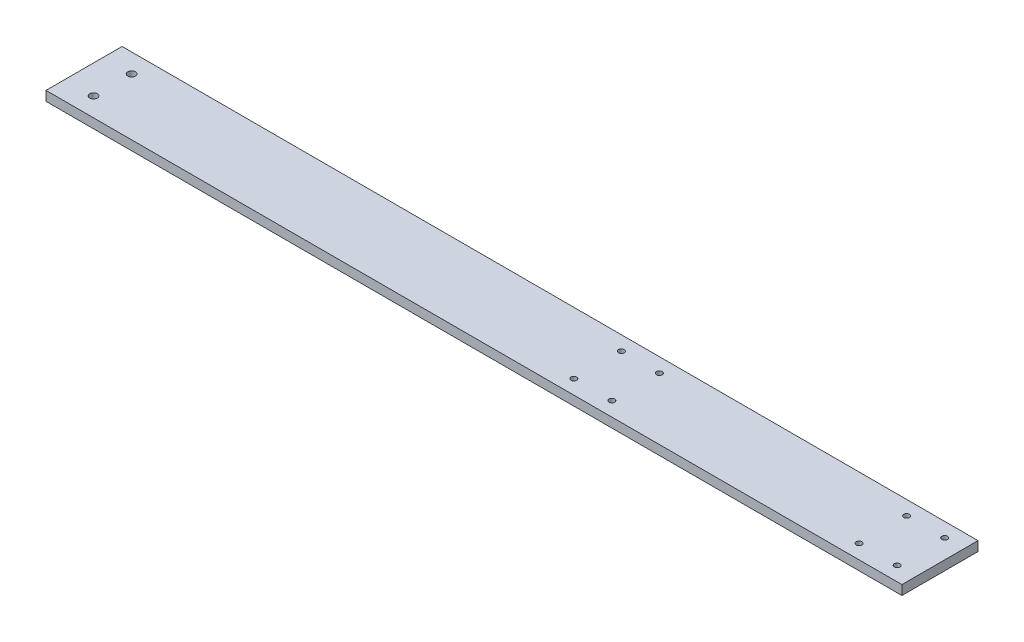
ISO-10303-21;
HEADER;
FILE_DESCRIPTION(('STEP AP214'),'2;1');
FILE_NAME('part.step','',(''),(''),'','','');
FILE_SCHEMA(('AUTOMOTIVE_DESIGN { 1 0 10303 214 1 1 1 1 }'));
ENDSEC;
DATA;
#1=APPLICATION_CONTEXT('core data for automotive mechanical design processes');
#2=APPLICATION_PROTOCOL_DEFINITION('international standard','automotive_design',2000,#1);
#3=PRODUCT_CONTEXT('',#1,'mechanical');
#4=PRODUCT('Part','Part','',(#3));
#5=PRODUCT_RELATED_PRODUCT_CATEGORY('part','',(#4));
#6=PRODUCT_DEFINITION_FORMATION('','',#4);
#7=PRODUCT_DEFINITION_CONTEXT('part definition',#1,'design');
#8=PRODUCT_DEFINITION('design','',#6,#7);
#9=PRODUCT_DEFINITION_SHAPE('','',#8);
#10=(LENGTH_UNIT() NAMED_UNIT(*) SI_UNIT(.MILLI.,.METRE.));
#11=(NAMED_UNIT(*) PLANE_ANGLE_UNIT() SI_UNIT($,.RADIAN.));
#12=(NAMED_UNIT(*) SI_UNIT($,.STERADIAN.) SOLID_ANGLE_UNIT());
#13=UNCERTAINTY_MEASURE_WITH_UNIT(LENGTH_MEASURE(1.E-05),#10,'distance_accuracy_value','');
#14=(GEOMETRIC_REPRESENTATION_CONTEXT(3) GLOBAL_UNCERTAINTY_ASSIGNED_CONTEXT((#13)) GLOBAL_UNIT_ASSIGNED_CONTEXT((#10,
#11,#12)) REPRESENTATION_CONTEXT('',''));
#15=CARTESIAN_POINT('',(0.,0.,0.));
#16=DIRECTION('',(0.,0.,1.));
#17=DIRECTION('',(1.,0.,0.));
#18=AXIS2_PLACEMENT_3D('',#15,#16,#17);
#19=CARTESIAN_POINT('',(0.,5.,0.));
#20=DIRECTION('',(0.,1.,0.));
#21=DIRECTION('',(0.,0.,1.));
#22=AXIS2_PLACEMENT_3D('',#19,#20,#21);
#23=PLANE('',#22);
#24=CARTESIAN_POINT('',(-210.,5.,10.));
#25=DIRECTION('',(0.,1.,0.));
#26=DIRECTION('',(0.,0.,1.));
#27=AXIS2_PLACEMENT_3D('',#24,#25,#26);
#28=CIRCLE('',#27,2.);
#29=CARTESIAN_POINT('',(-210.,5.,12.));
#30=VERTEX_POINT('',#29);
#31=EDGE_CURVE('E192',#30,#30,#28,.T.);
#32=ORIENTED_EDGE('',*,*,#31,.F.);
#33=EDGE_LOOP('',(#32));
#34=FACE_BOUND('',#33,.T.);
#35=CARTESIAN_POINT('',(45.,5.,12.5));
#36=DIRECTION('',(0.,1.,0.));
#37=DIRECTION('',(0.,0.,-1.));
#38=AXIS2_PLACEMENT_3D('',#35,#36,#37);
#39=CIRCLE('',#38,1.5);
#40=CARTESIAN_POINT('',(45.,5.,11.));
#41=VERTEX_POINT('',#40);
#42=EDGE_CURVE('E199',#41,#41,#39,.T.);
#43=ORIENTED_EDGE('',*,*,#42,.F.);
#44=EDGE_LOOP('',(#43));
#45=FACE_BOUND('',#44,.T.);
#46=CARTESIAN_POINT('',(65.,5.,-12.5));
#47=DIRECTION('',(0.,1.,0.));
#48=DIRECTION('',(0.,0.,1.));
#49=AXIS2_PLACEMENT_3D('',#46,#47,#48);
#50=CIRCLE('',#49,1.5);
#51=CARTESIAN_POINT('',(65.,5.,-11.));
#52=VERTEX_POINT('',#51);
#53=EDGE_CURVE('E205',#52,#52,#50,.T.);
#54=ORIENTED_EDGE('',*,*,#53,.F.);
#55=EDGE_LOOP('',(#54));
#56=FACE_BOUND('',#55,.T.);
#57=CARTESIAN_POINT('',(195.,5.,12.5));
#58=DIRECTION('',(0.,1.,0.));
#59=DIRECTION('',(0.,0.,-1.));
#60=AXIS2_PLACEMENT_3D('',#57,#58,#59);
#61=CIRCLE('',#60,1.5);
#62=CARTESIAN_POINT('',(195.,5.,11.));
#63=VERTEX_POINT('',#62);
#64=EDGE_CURVE('E211',#63,#63,#61,.T.);
#65=ORIENTED_EDGE('',*,*,#64,.F.);
#66=EDGE_LOOP('',(#65));
#67=FACE_BOUND('',#66,.T.);
#68=CARTESIAN_POINT('',(215.,5.,-12.5));
#69=DIRECTION('',(0.,1.,0.));
#70=DIRECTION('',(0.,0.,1.));
#71=AXIS2_PLACEMENT_3D('',#68,#69,#70);
#72=CIRCLE('',#71,1.5);
#73=CARTESIAN_POINT('',(215.,5.,-11.));
#74=VERTEX_POINT('',#73);
#75=EDGE_CURVE('E109',#74,#74,#72,.T.);
#76=ORIENTED_EDGE('',*,*,#75,.F.);
#77=EDGE_LOOP('',(#76));
#78=FACE_BOUND('',#77,.T.);
#79=DIRECTION('',(0.,0.,1.));
#80=VECTOR('',#79,1.);
#81=CARTESIAN_POINT('',(-225.,5.,-20.));
#82=LINE('',#81,#80);
#83=CARTESIAN_POINT('',(-225.,5.,-20.));
#84=VERTEX_POINT('',#83);
#85=CARTESIAN_POINT('',(-225.,5.,20.));
#86=VERTEX_POINT('',#85);
#87=EDGE_CURVE('E91',#84,#86,#82,.T.);
#88=ORIENTED_EDGE('',*,*,#87,.T.);
#89=DIRECTION('',(1.,0.,0.));
#90=VECTOR('',#89,1.);
#91=CARTESIAN_POINT('',(-225.,5.,20.));
#92=LINE('',#91,#90);
#93=CARTESIAN_POINT('',(225.,5.,20.));
#94=VERTEX_POINT('',#93);
#95=EDGE_CURVE('E86',#86,#94,#92,.T.);
#96=ORIENTED_EDGE('',*,*,#95,.T.);
#97=DIRECTION('',(0.,0.,-1.));
#98=VECTOR('',#97,1.);
#99=CARTESIAN_POINT('',(225.,5.,-20.));
#100=LINE('',#99,#98);
#101=CARTESIAN_POINT('',(225.,5.,-20.));
#102=VERTEX_POINT('',#101);
#103=EDGE_CURVE('E89',#94,#102,#100,.T.);
#104=ORIENTED_EDGE('',*,*,#103,.T.);
#105=DIRECTION('',(-1.,0.,0.));
#106=VECTOR('',#105,1.);
#107=CARTESIAN_POINT('',(-225.,5.,-20.));
#108=LINE('',#107,#106);
#109=EDGE_CURVE('E55',#102,#84,#108,.T.);
#110=ORIENTED_EDGE('',*,*,#109,.T.);
#111=EDGE_LOOP('',(#88,#96,#104,#110));
#112=FACE_BOUND('',#111,.T.);
#113=CARTESIAN_POINT('',(195.,5.,-12.5));
#114=DIRECTION('',(0.,1.,0.));
#115=DIRECTION('',(0.,0.,1.));
#116=AXIS2_PLACEMENT_3D('',#113,#114,#115);
#117=CIRCLE('',#116,1.5);
#118=CARTESIAN_POINT('',(195.,5.,-11.));
#119=VERTEX_POINT('',#118);
#120=EDGE_CURVE('E214',#119,#119,#117,.T.);
#121=ORIENTED_EDGE('',*,*,#120,.F.);
#122=EDGE_LOOP('',(#121));
#123=FACE_BOUND('',#122,.T.);
#124=CARTESIAN_POINT('',(215.,5.,12.5));
#125=DIRECTION('',(0.,1.,0.));
#126=DIRECTION('',(0.,0.,-1.));
#127=AXIS2_PLACEMENT_3D('',#124,#125,#126);
#128=CIRCLE('',#127,1.5);
#129=CARTESIAN_POINT('',(215.,5.,11.));
#130=VERTEX_POINT('',#129);
#131=EDGE_CURVE('E208',#130,#130,#128,.T.);
#132=ORIENTED_EDGE('',*,*,#131,.F.);
#133=EDGE_LOOP('',(#132));
#134=FACE_BOUND('',#133,.T.);
#135=CARTESIAN_POINT('',(45.,5.,-12.5));
#136=DIRECTION('',(0.,1.,0.));
#137=DIRECTION('',(0.,0.,1.));
#138=AXIS2_PLACEMENT_3D('',#135,#136,#137);
#139=CIRCLE('',#138,1.5);
#140=CARTESIAN_POINT('',(45.,5.,-11.));
#141=VERTEX_POINT('',#140);
#142=EDGE_CURVE('E202',#141,#141,#139,.T.);
#143=ORIENTED_EDGE('',*,*,#142,.F.);
#144=EDGE_LOOP('',(#143));
#145=FACE_BOUND('',#144,.T.);
#146=CARTESIAN_POINT('',(65.,5.,12.5));
#147=DIRECTION('',(0.,1.,0.));
#148=DIRECTION('',(0.,0.,-1.));
#149=AXIS2_PLACEMENT_3D('',#146,#147,#148);
#150=CIRCLE('',#149,1.5);
#151=CARTESIAN_POINT('',(65.,5.,11.));
#152=VERTEX_POINT('',#151);
#153=EDGE_CURVE('E195',#152,#152,#150,.T.);
#154=ORIENTED_EDGE('',*,*,#153,.F.);
#155=EDGE_LOOP('',(#154));
#156=FACE_BOUND('',#155,.T.);
#157=CARTESIAN_POINT('',(-210.,5.,-10.));
#158=DIRECTION('',(0.,1.,0.));
#159=DIRECTION('',(0.,0.,1.));
#160=AXIS2_PLACEMENT_3D('',#157,#158,#159);
#161=CIRCLE('',#160,2.);
#162=CARTESIAN_POINT('',(-210.,5.,-8.));
#163=VERTEX_POINT('',#162);
#164=EDGE_CURVE('E187',#163,#163,#161,.T.);
#165=ORIENTED_EDGE('',*,*,#164,.F.);
#166=EDGE_LOOP('',(#165));
#167=FACE_BOUND('',#166,.T.);
#168=ADVANCED_FACE('F37',(#34,#45,#56,#67,#78,#112,#123,#134,#145,#156,#167),#23,.T.);
#169=CARTESIAN_POINT('',(0.,0.,0.));
#170=DIRECTION('',(0.,1.,0.));
#171=DIRECTION('',(0.,0.,1.));
#172=AXIS2_PLACEMENT_3D('',#169,#170,#171);
#173=PLANE('',#172);
#174=CARTESIAN_POINT('',(45.,0.,-12.5));
#175=DIRECTION('',(0.,1.,0.));
#176=DIRECTION('',(0.,0.,1.));
#177=AXIS2_PLACEMENT_3D('',#174,#175,#176);
#178=CIRCLE('',#177,3.50000000000006);
#179=CARTESIAN_POINT('',(45.,0.,-8.99999999999994));
#180=VERTEX_POINT('',#179);
#181=EDGE_CURVE('E137',#180,#180,#178,.T.);
#182=ORIENTED_EDGE('',*,*,#181,.T.);
#183=EDGE_LOOP('',(#182));
#184=FACE_BOUND('',#183,.T.);
#185=CARTESIAN_POINT('',(45.,0.,12.5));
#186=DIRECTION('',(0.,1.,0.));
#187=DIRECTION('',(0.,0.,1.));
#188=AXIS2_PLACEMENT_3D('',#185,#186,#187);
#189=CIRCLE('',#188,3.50000000000006);
#190=CARTESIAN_POINT('',(45.,0.,16.0000000000001));
#191=VERTEX_POINT('',#190);
#192=EDGE_CURVE('E134',#191,#191,#189,.T.);
#193=ORIENTED_EDGE('',*,*,#192,.T.);
#194=EDGE_LOOP('',(#193));
#195=FACE_BOUND('',#194,.T.);
#196=CARTESIAN_POINT('',(65.,0.,12.5));
#197=DIRECTION('',(0.,1.,0.));
#198=DIRECTION('',(0.,0.,1.));
#199=AXIS2_PLACEMENT_3D('',#196,#197,#198);
#200=CIRCLE('',#199,3.5);
#201=CARTESIAN_POINT('',(65.,0.,16.));
#202=VERTEX_POINT('',#201);
#203=EDGE_CURVE('E131',#202,#202,#200,.T.);
#204=ORIENTED_EDGE('',*,*,#203,.T.);
#205=EDGE_LOOP('',(#204));
#206=FACE_BOUND('',#205,.T.);
#207=CARTESIAN_POINT('',(65.,0.,-12.5));
#208=DIRECTION('',(0.,1.,0.));
#209=DIRECTION('',(0.,0.,1.));
#210=AXIS2_PLACEMENT_3D('',#207,#208,#209);
#211=CIRCLE('',#210,3.5);
#212=CARTESIAN_POINT('',(65.,0.,-9.));
#213=VERTEX_POINT('',#212);
#214=EDGE_CURVE('E128',#213,#213,#211,.T.);
#215=ORIENTED_EDGE('',*,*,#214,.T.);
#216=EDGE_LOOP('',(#215));
#217=FACE_BOUND('',#216,.T.);
#218=CARTESIAN_POINT('',(215.,0.,-12.5));
#219=DIRECTION('',(0.,1.,0.));
#220=DIRECTION('',(0.,0.,1.));
#221=AXIS2_PLACEMENT_3D('',#218,#219,#220);
#222=CIRCLE('',#221,3.5);
#223=CARTESIAN_POINT('',(215.,0.,-9.));
#224=VERTEX_POINT('',#223);
#225=EDGE_CURVE('E125',#224,#224,#222,.T.);
#226=ORIENTED_EDGE('',*,*,#225,.T.);
#227=EDGE_LOOP('',(#226));
#228=FACE_BOUND('',#227,.T.);
#229=CARTESIAN_POINT('',(195.,0.,-12.5));
#230=DIRECTION('',(0.,1.,0.));
#231=DIRECTION('',(0.,0.,1.));
#232=AXIS2_PLACEMENT_3D('',#229,#230,#231);
#233=CIRCLE('',#232,3.5);
#234=CARTESIAN_POINT('',(195.,0.,-9.));
#235=VERTEX_POINT('',#234);
#236=EDGE_CURVE('E122',#235,#235,#233,.T.);
#237=ORIENTED_EDGE('',*,*,#236,.T.);
#238=EDGE_LOOP('',(#237));
#239=FACE_BOUND('',#238,.T.);
#240=CARTESIAN_POINT('',(195.,0.,12.5));
#241=DIRECTION('',(0.,1.,0.));
#242=DIRECTION('',(0.,0.,1.));
#243=AXIS2_PLACEMENT_3D('',#240,#241,#242);
#244=CIRCLE('',#243,3.5);
#245=CARTESIAN_POINT('',(195.,0.,16.));
#246=VERTEX_POINT('',#245);
#247=EDGE_CURVE('E119',#246,#246,#244,.T.);
#248=ORIENTED_EDGE('',*,*,#247,.T.);
#249=EDGE_LOOP('',(#248));
#250=FACE_BOUND('',#249,.T.);
#251=CARTESIAN_POINT('',(215.,0.,12.5));
#252=DIRECTION('',(0.,1.,0.));
#253=DIRECTION('',(0.,0.,1.));
#254=AXIS2_PLACEMENT_3D('',#251,#252,#253);
#255=CIRCLE('',#254,3.5);
#256=CARTESIAN_POINT('',(215.,0.,16.));
#257=VERTEX_POINT('',#256);
#258=EDGE_CURVE('E116',#257,#257,#255,.T.);
#259=ORIENTED_EDGE('',*,*,#258,.T.);
#260=EDGE_LOOP('',(#259));
#261=FACE_BOUND('',#260,.T.);
#262=DIRECTION('',(0.,0.,1.));
#263=VECTOR('',#262,1.);
#264=CARTESIAN_POINT('',(-225.,0.,-20.));
#265=LINE('',#264,#263);
#266=CARTESIAN_POINT('',(-225.,0.,-20.));
#267=VERTEX_POINT('',#266);
#268=CARTESIAN_POINT('',(-225.,0.,20.));
#269=VERTEX_POINT('',#268);
#270=EDGE_CURVE('E106',#267,#269,#265,.T.);
#271=ORIENTED_EDGE('',*,*,#270,.F.);
#272=DIRECTION('',(-1.,0.,0.));
#273=VECTOR('',#272,1.);
#274=CARTESIAN_POINT('',(-225.,0.,-20.));
#275=LINE('',#274,#273);
#276=CARTESIAN_POINT('',(225.,0.,-20.));
#277=VERTEX_POINT('',#276);
#278=EDGE_CURVE('E78',#277,#267,#275,.T.);
#279=ORIENTED_EDGE('',*,*,#278,.F.);
#280=DIRECTION('',(0.,0.,-1.));
#281=VECTOR('',#280,1.);
#282=CARTESIAN_POINT('',(225.,0.,-20.));
#283=LINE('',#282,#281);
#284=CARTESIAN_POINT('',(225.,0.,20.));
#285=VERTEX_POINT('',#284);
#286=EDGE_CURVE('E72',#285,#277,#283,.T.);
#287=ORIENTED_EDGE('',*,*,#286,.F.);
#288=DIRECTION('',(1.,0.,0.));
#289=VECTOR('',#288,1.);
#290=CARTESIAN_POINT('',(-225.,0.,20.));
#291=LINE('',#290,#289);
#292=EDGE_CURVE('E96',#269,#285,#291,.T.);
#293=ORIENTED_EDGE('',*,*,#292,.F.);
#294=EDGE_LOOP('',(#271,#279,#287,#293));
#295=FACE_BOUND('',#294,.T.);
#296=CARTESIAN_POINT('',(-210.,0.,10.));
#297=DIRECTION('',(0.,1.,0.));
#298=DIRECTION('',(0.,0.,1.));
#299=AXIS2_PLACEMENT_3D('',#296,#297,#298);
#300=CIRCLE('',#299,2.);
#301=CARTESIAN_POINT('',(-210.,0.,12.));
#302=VERTEX_POINT('',#301);
#303=EDGE_CURVE('E182',#302,#302,#300,.T.);
#304=ORIENTED_EDGE('',*,*,#303,.T.);
#305=EDGE_LOOP('',(#304));
#306=FACE_BOUND('',#305,.T.);
#307=CARTESIAN_POINT('',(-210.,0.,-10.));
#308=DIRECTION('',(0.,1.,0.));
#309=DIRECTION('',(0.,0.,1.));
#310=AXIS2_PLACEMENT_3D('',#307,#308,#309);
#311=CIRCLE('',#310,2.);
#312=CARTESIAN_POINT('',(-210.,0.,-8.));
#313=VERTEX_POINT('',#312);
#314=EDGE_CURVE('E185',#313,#313,#311,.T.);
#315=ORIENTED_EDGE('',*,*,#314,.T.);
#316=EDGE_LOOP('',(#315));
#317=FACE_BOUND('',#316,.T.);
#318=ADVANCED_FACE('F169',(#184,#195,#206,#217,#228,#239,#250,#261,#295,#306,#317),#173,.F.);
#319=CARTESIAN_POINT('',(-225.,5.,-20.));
#320=DIRECTION('',(1.,0.,0.));
#321=DIRECTION('',(0.,0.,-1.));
#322=AXIS2_PLACEMENT_3D('',#319,#320,#321);
#323=PLANE('',#322);
#324=ORIENTED_EDGE('',*,*,#270,.T.);
#325=DIRECTION('',(0.,-1.,0.));
#326=VECTOR('',#325,1.);
#327=CARTESIAN_POINT('',(-225.,5.,20.));
#328=LINE('',#327,#326);
#329=EDGE_CURVE('E97',#86,#269,#328,.T.);
#330=ORIENTED_EDGE('',*,*,#329,.F.);
#331=ORIENTED_EDGE('',*,*,#87,.F.);
#332=DIRECTION('',(0.,-1.,0.));
#333=VECTOR('',#332,1.);
#334=CARTESIAN_POINT('',(-225.,5.,-20.));
#335=LINE('',#334,#333);
#336=EDGE_CURVE('E102',#84,#267,#335,.T.);
#337=ORIENTED_EDGE('',*,*,#336,.T.);
#338=EDGE_LOOP('',(#324,#330,#331,#337));
#339=FACE_BOUND('',#338,.T.);
#340=ADVANCED_FACE('F172',(#339),#323,.F.);
#341=CARTESIAN_POINT('',(-225.,5.,20.));
#342=DIRECTION('',(0.,0.,-1.));
#343=DIRECTION('',(-1.,0.,0.));
#344=AXIS2_PLACEMENT_3D('',#341,#342,#343);
#345=PLANE('',#344);
#346=ORIENTED_EDGE('',*,*,#292,.T.);
#347=DIRECTION('',(0.,-1.,0.));
#348=VECTOR('',#347,1.);
#349=CARTESIAN_POINT('',(225.,5.,20.));
#350=LINE('',#349,#348);
#351=EDGE_CURVE('E94',#94,#285,#350,.T.);
#352=ORIENTED_EDGE('',*,*,#351,.F.);
#353=ORIENTED_EDGE('',*,*,#95,.F.);
#354=ORIENTED_EDGE('',*,*,#329,.T.);
#355=EDGE_LOOP('',(#346,#352,#353,#354));
#356=FACE_BOUND('',#355,.T.);
#357=ADVANCED_FACE('F95',(#356),#345,.F.);
#358=CARTESIAN_POINT('',(225.,5.,-20.));
#359=DIRECTION('',(-1.,0.,0.));
#360=DIRECTION('',(0.,0.,1.));
#361=AXIS2_PLACEMENT_3D('',#358,#359,#360);
#362=PLANE('',#361);
#363=ORIENTED_EDGE('',*,*,#286,.T.);
#364=DIRECTION('',(0.,-1.,0.));
#365=VECTOR('',#364,1.);
#366=CARTESIAN_POINT('',(225.,5.,-20.));
#367=LINE('',#366,#365);
#368=EDGE_CURVE('E98',#102,#277,#367,.T.);
#369=ORIENTED_EDGE('',*,*,#368,.F.);
#370=ORIENTED_EDGE('',*,*,#103,.F.);
#371=ORIENTED_EDGE('',*,*,#351,.T.);
#372=EDGE_LOOP('',(#363,#369,#370,#371));
#373=FACE_BOUND('',#372,.T.);
#374=ADVANCED_FACE('F100',(#373),#362,.F.);
#375=CARTESIAN_POINT('',(-225.,5.,-20.));
#376=DIRECTION('',(0.,0.,1.));
#377=DIRECTION('',(1.,0.,0.));
#378=AXIS2_PLACEMENT_3D('',#375,#376,#377);
#379=PLANE('',#378);
#380=ORIENTED_EDGE('',*,*,#278,.T.);
#381=ORIENTED_EDGE('',*,*,#336,.F.);
#382=ORIENTED_EDGE('',*,*,#109,.F.);
#383=ORIENTED_EDGE('',*,*,#368,.T.);
#384=EDGE_LOOP('',(#380,#381,#382,#383));
#385=FACE_BOUND('',#384,.T.);
#386=ADVANCED_FACE('F232',(#385),#379,.F.);
#387=CARTESIAN_POINT('',(215.,5.,-12.5));
#388=DIRECTION('',(0.,-1.,0.));
#389=DIRECTION('',(0.,0.,-1.));
#390=AXIS2_PLACEMENT_3D('',#387,#388,#389);
#391=CYLINDRICAL_SURFACE('',#390,1.5);
#392=CARTESIAN_POINT('',(215.,2.,-12.5));
#393=DIRECTION('',(0.,1.,0.));
#394=DIRECTION('',(0.,0.,1.));
#395=AXIS2_PLACEMENT_3D('',#392,#393,#394);
#396=CIRCLE('',#395,1.5);
#397=CARTESIAN_POINT('',(215.,2.,-11.));
#398=VERTEX_POINT('',#397);
#399=EDGE_CURVE('E152',#398,#398,#396,.F.);
#400=ORIENTED_EDGE('',*,*,#399,.T.);
#401=EDGE_LOOP('',(#400));
#402=FACE_BOUND('',#401,.T.);
#403=ORIENTED_EDGE('',*,*,#75,.T.);
#404=EDGE_LOOP('',(#403));
#405=FACE_BOUND('',#404,.T.);
#406=ADVANCED_FACE('F220',(#402,#405),#391,.F.);
#407=CARTESIAN_POINT('',(195.,5.,-12.5));
#408=DIRECTION('',(0.,-1.,0.));
#409=DIRECTION('',(0.,0.,-1.));
#410=AXIS2_PLACEMENT_3D('',#407,#408,#409);
#411=CYLINDRICAL_SURFACE('',#410,1.5);
#412=CARTESIAN_POINT('',(195.,2.,-12.5));
#413=DIRECTION('',(0.,1.,0.));
#414=DIRECTION('',(0.,0.,1.));
#415=AXIS2_PLACEMENT_3D('',#412,#413,#414);
#416=CIRCLE('',#415,1.5);
#417=CARTESIAN_POINT('',(195.,2.,-11.));
#418=VERTEX_POINT('',#417);
#419=EDGE_CURVE('E155',#418,#418,#416,.F.);
#420=ORIENTED_EDGE('',*,*,#419,.T.);
#421=EDGE_LOOP('',(#420));
#422=FACE_BOUND('',#421,.T.);
#423=ORIENTED_EDGE('',*,*,#120,.T.);
#424=EDGE_LOOP('',(#423));
#425=FACE_BOUND('',#424,.T.);
#426=ADVANCED_FACE('F295',(#422,#425),#411,.F.);
#427=CARTESIAN_POINT('',(195.,5.,12.5));
#428=DIRECTION('',(0.,-1.,0.));
#429=DIRECTION('',(0.,0.,-1.));
#430=AXIS2_PLACEMENT_3D('',#427,#428,#429);
#431=CYLINDRICAL_SURFACE('',#430,1.5);
#432=CARTESIAN_POINT('',(195.,2.,12.5));
#433=DIRECTION('',(0.,1.,0.));
#434=DIRECTION('',(0.,0.,1.));
#435=AXIS2_PLACEMENT_3D('',#432,#433,#434);
#436=CIRCLE('',#435,1.5);
#437=CARTESIAN_POINT('',(195.,2.,14.));
#438=VERTEX_POINT('',#437);
#439=EDGE_CURVE('E47',#438,#438,#436,.F.);
#440=ORIENTED_EDGE('',*,*,#439,.T.);
#441=EDGE_LOOP('',(#440));
#442=FACE_BOUND('',#441,.T.);
#443=ORIENTED_EDGE('',*,*,#64,.T.);
#444=EDGE_LOOP('',(#443));
#445=FACE_BOUND('',#444,.T.);
#446=ADVANCED_FACE('F160',(#442,#445),#431,.F.);
#447=CARTESIAN_POINT('',(215.,5.,12.5));
#448=DIRECTION('',(0.,-1.,0.));
#449=DIRECTION('',(0.,0.,-1.));
#450=AXIS2_PLACEMENT_3D('',#447,#448,#449);
#451=CYLINDRICAL_SURFACE('',#450,1.5);
#452=CARTESIAN_POINT('',(215.,2.,12.5));
#453=DIRECTION('',(0.,1.,0.));
#454=DIRECTION('',(0.,0.,1.));
#455=AXIS2_PLACEMENT_3D('',#452,#453,#454);
#456=CIRCLE('',#455,1.5);
#457=CARTESIAN_POINT('',(215.,2.,14.));
#458=VERTEX_POINT('',#457);
#459=EDGE_CURVE('E11',#458,#458,#456,.F.);
#460=ORIENTED_EDGE('',*,*,#459,.T.);
#461=EDGE_LOOP('',(#460));
#462=FACE_BOUND('',#461,.T.);
#463=ORIENTED_EDGE('',*,*,#131,.T.);
#464=EDGE_LOOP('',(#463));
#465=FACE_BOUND('',#464,.T.);
#466=ADVANCED_FACE('F332',(#462,#465),#451,.F.);
#467=CARTESIAN_POINT('',(65.,5.,-12.5));
#468=DIRECTION('',(0.,-1.,0.));
#469=DIRECTION('',(0.,0.,-1.));
#470=AXIS2_PLACEMENT_3D('',#467,#468,#469);
#471=CYLINDRICAL_SURFACE('',#470,1.5);
#472=CARTESIAN_POINT('',(65.,2.,-12.5));
#473=DIRECTION('',(0.,1.,0.));
#474=DIRECTION('',(0.,0.,1.));
#475=AXIS2_PLACEMENT_3D('',#472,#473,#474);
#476=CIRCLE('',#475,1.5);
#477=CARTESIAN_POINT('',(65.,2.,-11.));
#478=VERTEX_POINT('',#477);
#479=EDGE_CURVE('E149',#478,#478,#476,.F.);
#480=ORIENTED_EDGE('',*,*,#479,.T.);
#481=EDGE_LOOP('',(#480));
#482=FACE_BOUND('',#481,.T.);
#483=ORIENTED_EDGE('',*,*,#53,.T.);
#484=EDGE_LOOP('',(#483));
#485=FACE_BOUND('',#484,.T.);
#486=ADVANCED_FACE('F328',(#482,#485),#471,.F.);
#487=CARTESIAN_POINT('',(45.,5.,-12.5));
#488=DIRECTION('',(0.,-1.,0.));
#489=DIRECTION('',(0.,0.,-1.));
#490=AXIS2_PLACEMENT_3D('',#487,#488,#489);
#491=CYLINDRICAL_SURFACE('',#490,1.5);
#492=CARTESIAN_POINT('',(45.,2.00000000000006,-12.5));
#493=DIRECTION('',(0.,1.,0.));
#494=DIRECTION('',(0.,0.,1.));
#495=AXIS2_PLACEMENT_3D('',#492,#493,#494);
#496=CIRCLE('',#495,1.5);
#497=CARTESIAN_POINT('',(45.,2.00000000000006,-11.));
#498=VERTEX_POINT('',#497);
#499=EDGE_CURVE('E140',#498,#498,#496,.F.);
#500=ORIENTED_EDGE('',*,*,#499,.T.);
#501=EDGE_LOOP('',(#500));
#502=FACE_BOUND('',#501,.T.);
#503=ORIENTED_EDGE('',*,*,#142,.T.);
#504=EDGE_LOOP('',(#503));
#505=FACE_BOUND('',#504,.T.);
#506=ADVANCED_FACE('F324',(#502,#505),#491,.F.);
#507=CARTESIAN_POINT('',(45.,5.,12.5));
#508=DIRECTION('',(0.,-1.,0.));
#509=DIRECTION('',(0.,0.,-1.));
#510=AXIS2_PLACEMENT_3D('',#507,#508,#509);
#511=CYLINDRICAL_SURFACE('',#510,1.5);
#512=CARTESIAN_POINT('',(45.,2.00000000000006,12.5));
#513=DIRECTION('',(0.,1.,0.));
#514=DIRECTION('',(0.,0.,1.));
#515=AXIS2_PLACEMENT_3D('',#512,#513,#514);
#516=CIRCLE('',#515,1.5);
#517=CARTESIAN_POINT('',(45.,2.00000000000006,14.));
#518=VERTEX_POINT('',#517);
#519=EDGE_CURVE('E143',#518,#518,#516,.F.);
#520=ORIENTED_EDGE('',*,*,#519,.T.);
#521=EDGE_LOOP('',(#520));
#522=FACE_BOUND('',#521,.T.);
#523=ORIENTED_EDGE('',*,*,#42,.T.);
#524=EDGE_LOOP('',(#523));
#525=FACE_BOUND('',#524,.T.);
#526=ADVANCED_FACE('F320',(#522,#525),#511,.F.);
#527=CARTESIAN_POINT('',(65.,5.,12.5));
#528=DIRECTION('',(0.,-1.,0.));
#529=DIRECTION('',(0.,0.,-1.));
#530=AXIS2_PLACEMENT_3D('',#527,#528,#529);
#531=CYLINDRICAL_SURFACE('',#530,1.5);
#532=CARTESIAN_POINT('',(65.,2.,12.5));
#533=DIRECTION('',(0.,1.,0.));
#534=DIRECTION('',(0.,0.,1.));
#535=AXIS2_PLACEMENT_3D('',#532,#533,#534);
#536=CIRCLE('',#535,1.5);
#537=CARTESIAN_POINT('',(65.,2.,14.));
#538=VERTEX_POINT('',#537);
#539=EDGE_CURVE('E146',#538,#538,#536,.F.);
#540=ORIENTED_EDGE('',*,*,#539,.T.);
#541=EDGE_LOOP('',(#540));
#542=FACE_BOUND('',#541,.T.);
#543=ORIENTED_EDGE('',*,*,#153,.T.);
#544=EDGE_LOOP('',(#543));
#545=FACE_BOUND('',#544,.T.);
#546=ADVANCED_FACE('F314',(#542,#545),#531,.F.);
#547=CARTESIAN_POINT('',(-210.,5.,10.));
#548=DIRECTION('',(0.,-1.,0.));
#549=DIRECTION('',(0.,0.,-1.));
#550=AXIS2_PLACEMENT_3D('',#547,#548,#549);
#551=CYLINDRICAL_SURFACE('',#550,2.);
#552=ORIENTED_EDGE('',*,*,#31,.T.);
#553=EDGE_LOOP('',(#552));
#554=FACE_BOUND('',#553,.T.);
#555=ORIENTED_EDGE('',*,*,#303,.F.);
#556=EDGE_LOOP('',(#555));
#557=FACE_BOUND('',#556,.T.);
#558=ADVANCED_FACE('F309',(#554,#557),#551,.F.);
#559=CARTESIAN_POINT('',(-210.,5.,-10.));
#560=DIRECTION('',(0.,-1.,0.));
#561=DIRECTION('',(0.,0.,-1.));
#562=AXIS2_PLACEMENT_3D('',#559,#560,#561);
#563=CYLINDRICAL_SURFACE('',#562,2.);
#564=ORIENTED_EDGE('',*,*,#164,.T.);
#565=EDGE_LOOP('',(#564));
#566=FACE_BOUND('',#565,.T.);
#567=ORIENTED_EDGE('',*,*,#314,.F.);
#568=EDGE_LOOP('',(#567));
#569=FACE_BOUND('',#568,.T.);
#570=ADVANCED_FACE('F250',(#566,#569),#563,.F.);
#571=CARTESIAN_POINT('',(45.,0.,-12.5));
#572=DIRECTION('',(0.,-1.,0.));
#573=DIRECTION('',(0.,0.,-1.));
#574=AXIS2_PLACEMENT_3D('',#571,#572,#573);
#575=CONICAL_SURFACE('',#574,3.50000000000006,0.78539816339745);
#576=ORIENTED_EDGE('',*,*,#499,.F.);
#577=EDGE_LOOP('',(#576));
#578=FACE_BOUND('',#577,.T.);
#579=ORIENTED_EDGE('',*,*,#181,.F.);
#580=EDGE_LOOP('',(#579));
#581=FACE_BOUND('',#580,.T.);
#582=ADVANCED_FACE('F243',(#578,#581),#575,.F.);
#583=CARTESIAN_POINT('',(45.,0.,12.5));
#584=DIRECTION('',(0.,-1.,0.));
#585=DIRECTION('',(0.,0.,-1.));
#586=AXIS2_PLACEMENT_3D('',#583,#584,#585);
#587=CONICAL_SURFACE('',#586,3.50000000000006,0.78539816339745);
#588=ORIENTED_EDGE('',*,*,#519,.F.);
#589=EDGE_LOOP('',(#588));
#590=FACE_BOUND('',#589,.T.);
#591=ORIENTED_EDGE('',*,*,#192,.F.);
#592=EDGE_LOOP('',(#591));
#593=FACE_BOUND('',#592,.T.);
#594=ADVANCED_FACE('F249',(#590,#593),#587,.F.);
#595=CARTESIAN_POINT('',(65.,0.,12.5));
#596=DIRECTION('',(0.,-1.,0.));
#597=DIRECTION('',(0.,0.,-1.));
#598=AXIS2_PLACEMENT_3D('',#595,#596,#597);
#599=CONICAL_SURFACE('',#598,3.5,0.78539816339745);
#600=ORIENTED_EDGE('',*,*,#539,.F.);
#601=EDGE_LOOP('',(#600));
#602=FACE_BOUND('',#601,.T.);
#603=ORIENTED_EDGE('',*,*,#203,.F.);
#604=EDGE_LOOP('',(#603));
#605=FACE_BOUND('',#604,.T.);
#606=ADVANCED_FACE('F257',(#602,#605),#599,.F.);
#607=CARTESIAN_POINT('',(65.,0.,-12.5));
#608=DIRECTION('',(0.,-1.,0.));
#609=DIRECTION('',(0.,0.,-1.));
#610=AXIS2_PLACEMENT_3D('',#607,#608,#609);
#611=CONICAL_SURFACE('',#610,3.5,0.78539816339745);
#612=ORIENTED_EDGE('',*,*,#479,.F.);
#613=EDGE_LOOP('',(#612));
#614=FACE_BOUND('',#613,.T.);
#615=ORIENTED_EDGE('',*,*,#214,.F.);
#616=EDGE_LOOP('',(#615));
#617=FACE_BOUND('',#616,.T.);
#618=ADVANCED_FACE('F264',(#614,#617),#611,.F.);
#619=CARTESIAN_POINT('',(215.,0.,-12.5));
#620=DIRECTION('',(0.,-1.,0.));
#621=DIRECTION('',(0.,0.,-1.));
#622=AXIS2_PLACEMENT_3D('',#619,#620,#621);
#623=CONICAL_SURFACE('',#622,3.5,0.785398163397449);
#624=ORIENTED_EDGE('',*,*,#399,.F.);
#625=EDGE_LOOP('',(#624));
#626=FACE_BOUND('',#625,.T.);
#627=ORIENTED_EDGE('',*,*,#225,.F.);
#628=EDGE_LOOP('',(#627));
#629=FACE_BOUND('',#628,.T.);
#630=ADVANCED_FACE('F271',(#626,#629),#623,.F.);
#631=CARTESIAN_POINT('',(195.,0.,-12.5));
#632=DIRECTION('',(0.,-1.,0.));
#633=DIRECTION('',(0.,0.,-1.));
#634=AXIS2_PLACEMENT_3D('',#631,#632,#633);
#635=CONICAL_SURFACE('',#634,3.5,0.78539816339745);
#636=ORIENTED_EDGE('',*,*,#419,.F.);
#637=EDGE_LOOP('',(#636));
#638=FACE_BOUND('',#637,.T.);
#639=ORIENTED_EDGE('',*,*,#236,.F.);
#640=EDGE_LOOP('',(#639));
#641=FACE_BOUND('',#640,.T.);
#642=ADVANCED_FACE('F166',(#638,#641),#635,.F.);
#643=CARTESIAN_POINT('',(195.,0.,12.5));
#644=DIRECTION('',(0.,-1.,0.));
#645=DIRECTION('',(0.,0.,-1.));
#646=AXIS2_PLACEMENT_3D('',#643,#644,#645);
#647=CONICAL_SURFACE('',#646,3.5,0.78539816339745);
#648=ORIENTED_EDGE('',*,*,#439,.F.);
#649=EDGE_LOOP('',(#648));
#650=FACE_BOUND('',#649,.T.);
#651=ORIENTED_EDGE('',*,*,#247,.F.);
#652=EDGE_LOOP('',(#651));
#653=FACE_BOUND('',#652,.T.);
#654=ADVANCED_FACE('F163',(#650,#653),#647,.F.);
#655=CARTESIAN_POINT('',(215.,0.,12.5));
#656=DIRECTION('',(0.,-1.,0.));
#657=DIRECTION('',(0.,0.,-1.));
#658=AXIS2_PLACEMENT_3D('',#655,#656,#657);
#659=CONICAL_SURFACE('',#658,3.5,0.785398163397449);
#660=ORIENTED_EDGE('',*,*,#459,.F.);
#661=EDGE_LOOP('',(#660));
#662=FACE_BOUND('',#661,.T.);
#663=ORIENTED_EDGE('',*,*,#258,.F.);
#664=EDGE_LOOP('',(#663));
#665=FACE_BOUND('',#664,.T.);
#666=ADVANCED_FACE('F40',(#662,#665),#659,.F.);
#667=CLOSED_SHELL('',(#168,#318,#340,#357,#374,#386,#406,#426,#446,#466,#486,#506,#526,#546,
#558,#570,#582,#594,#606,#618,#630,#642,#654,#666));
#668=MANIFOLD_SOLID_BREP('B2',#667);
#669=ADVANCED_BREP_SHAPE_REPRESENTATION('',(#18,#668),#14);
#670=SHAPE_DEFINITION_REPRESENTATION(#9,#669);
ENDSEC;
END-ISO-10303-21;
